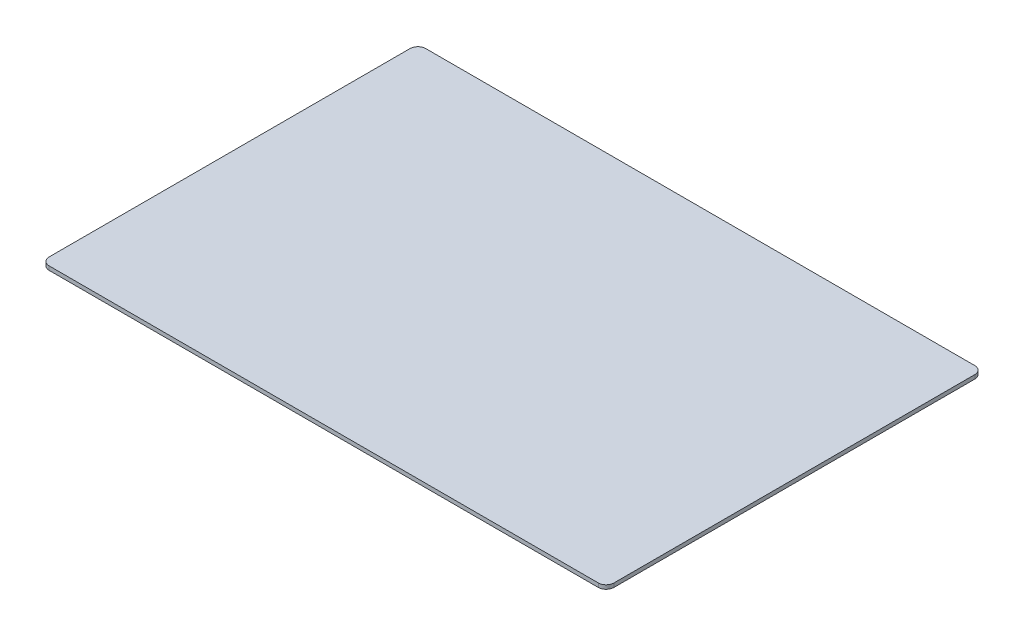
ISO-10303-21;
HEADER;
FILE_DESCRIPTION(('STEP AP214'),'2;1');
FILE_NAME('part.step','',(''),(''),'','','');
FILE_SCHEMA(('AUTOMOTIVE_DESIGN { 1 0 10303 214 1 1 1 1 }'));
ENDSEC;
DATA;
#1=APPLICATION_CONTEXT('core data for automotive mechanical design processes');
#2=APPLICATION_PROTOCOL_DEFINITION('international standard','automotive_design',2000,#1);
#3=PRODUCT_CONTEXT('',#1,'mechanical');
#4=PRODUCT('Part','Part','',(#3));
#5=PRODUCT_RELATED_PRODUCT_CATEGORY('part','',(#4));
#6=PRODUCT_DEFINITION_FORMATION('','',#4);
#7=PRODUCT_DEFINITION_CONTEXT('part definition',#1,'design');
#8=PRODUCT_DEFINITION('design','',#6,#7);
#9=PRODUCT_DEFINITION_SHAPE('','',#8);
#10=(LENGTH_UNIT() NAMED_UNIT(*) SI_UNIT(.MILLI.,.METRE.));
#11=(NAMED_UNIT(*) PLANE_ANGLE_UNIT() SI_UNIT($,.RADIAN.));
#12=(NAMED_UNIT(*) SI_UNIT($,.STERADIAN.) SOLID_ANGLE_UNIT());
#13=UNCERTAINTY_MEASURE_WITH_UNIT(LENGTH_MEASURE(1.E-05),#10,'distance_accuracy_value','');
#14=(GEOMETRIC_REPRESENTATION_CONTEXT(3) GLOBAL_UNCERTAINTY_ASSIGNED_CONTEXT((#13)) GLOBAL_UNIT_ASSIGNED_CONTEXT((#10,
#11,#12)) REPRESENTATION_CONTEXT('',''));
#15=CARTESIAN_POINT('',(0.,0.,0.));
#16=DIRECTION('',(0.,0.,1.));
#17=DIRECTION('',(1.,0.,0.));
#18=AXIS2_PLACEMENT_3D('',#15,#16,#17);
#19=CARTESIAN_POINT('',(228.6,3.175,152.4));
#20=DIRECTION('',(-1.,0.,0.));
#21=DIRECTION('',(0.,0.,1.));
#22=AXIS2_PLACEMENT_3D('',#19,#20,#21);
#23=PLANE('',#22);
#24=DIRECTION('',(0.,0.,-1.));
#25=VECTOR('',#24,1.);
#26=CARTESIAN_POINT('',(228.6,0.,152.4));
#27=LINE('',#26,#25);
#28=CARTESIAN_POINT('',(228.6,0.,146.05));
#29=VERTEX_POINT('',#28);
#30=CARTESIAN_POINT('',(228.6,0.,-146.05));
#31=VERTEX_POINT('',#30);
#32=EDGE_CURVE('E143',#29,#31,#27,.T.);
#33=ORIENTED_EDGE('',*,*,#32,.T.);
#34=DIRECTION('',(0.,-1.,0.));
#35=VECTOR('',#34,1.);
#36=CARTESIAN_POINT('',(228.6,3.175,-146.05));
#37=LINE('',#36,#35);
#38=CARTESIAN_POINT('',(228.6,3.175,-146.05));
#39=VERTEX_POINT('',#38);
#40=EDGE_CURVE('E177',#31,#39,#37,.F.);
#41=ORIENTED_EDGE('',*,*,#40,.T.);
#42=DIRECTION('',(0.,0.,-1.));
#43=VECTOR('',#42,1.);
#44=CARTESIAN_POINT('',(228.6,3.175,152.4));
#45=LINE('',#44,#43);
#46=CARTESIAN_POINT('',(228.6,3.175,146.05));
#47=VERTEX_POINT('',#46);
#48=EDGE_CURVE('E141',#47,#39,#45,.T.);
#49=ORIENTED_EDGE('',*,*,#48,.F.);
#50=DIRECTION('',(0.,-1.,0.));
#51=VECTOR('',#50,1.);
#52=CARTESIAN_POINT('',(228.6,3.175,146.05));
#53=LINE('',#52,#51);
#54=EDGE_CURVE('E173',#47,#29,#53,.T.);
#55=ORIENTED_EDGE('',*,*,#54,.T.);
#56=EDGE_LOOP('',(#33,#41,#49,#55));
#57=FACE_BOUND('',#56,.T.);
#58=ADVANCED_FACE('F41',(#57),#23,.F.);
#59=CARTESIAN_POINT('',(-228.6,3.175,-152.4));
#60=DIRECTION('',(0.,0.,1.));
#61=DIRECTION('',(1.,0.,0.));
#62=AXIS2_PLACEMENT_3D('',#59,#60,#61);
#63=PLANE('',#62);
#64=DIRECTION('',(-1.,0.,0.));
#65=VECTOR('',#64,1.);
#66=CARTESIAN_POINT('',(-228.6,0.,-152.4));
#67=LINE('',#66,#65);
#68=CARTESIAN_POINT('',(222.25,0.,-152.4));
#69=VERTEX_POINT('',#68);
#70=CARTESIAN_POINT('',(-222.25,0.,-152.4));
#71=VERTEX_POINT('',#70);
#72=EDGE_CURVE('E136',#69,#71,#67,.T.);
#73=ORIENTED_EDGE('',*,*,#72,.T.);
#74=DIRECTION('',(0.,-1.,0.));
#75=VECTOR('',#74,1.);
#76=CARTESIAN_POINT('',(-222.25,3.175,-152.4));
#77=LINE('',#76,#75);
#78=CARTESIAN_POINT('',(-222.25,3.175,-152.4));
#79=VERTEX_POINT('',#78);
#80=EDGE_CURVE('E112',#71,#79,#77,.F.);
#81=ORIENTED_EDGE('',*,*,#80,.T.);
#82=DIRECTION('',(-1.,0.,0.));
#83=VECTOR('',#82,1.);
#84=CARTESIAN_POINT('',(-228.6,3.175,-152.4));
#85=LINE('',#84,#83);
#86=CARTESIAN_POINT('',(222.25,3.175,-152.4));
#87=VERTEX_POINT('',#86);
#88=EDGE_CURVE('E197',#87,#79,#85,.T.);
#89=ORIENTED_EDGE('',*,*,#88,.F.);
#90=DIRECTION('',(0.,-1.,0.));
#91=VECTOR('',#90,1.);
#92=CARTESIAN_POINT('',(222.25,3.175,-152.4));
#93=LINE('',#92,#91);
#94=EDGE_CURVE('E118',#87,#69,#93,.T.);
#95=ORIENTED_EDGE('',*,*,#94,.T.);
#96=EDGE_LOOP('',(#73,#81,#89,#95));
#97=FACE_BOUND('',#96,.T.);
#98=ADVANCED_FACE('F222',(#97),#63,.F.);
#99=CARTESIAN_POINT('',(-228.6,3.175,152.4));
#100=DIRECTION('',(1.,0.,0.));
#101=DIRECTION('',(0.,0.,-1.));
#102=AXIS2_PLACEMENT_3D('',#99,#100,#101);
#103=PLANE('',#102);
#104=DIRECTION('',(0.,0.,1.));
#105=VECTOR('',#104,1.);
#106=CARTESIAN_POINT('',(-228.6,3.175,152.4));
#107=LINE('',#106,#105);
#108=CARTESIAN_POINT('',(-228.6,3.175,-146.05));
#109=VERTEX_POINT('',#108);
#110=CARTESIAN_POINT('',(-228.6,3.175,146.05));
#111=VERTEX_POINT('',#110);
#112=EDGE_CURVE('E127',#109,#111,#107,.T.);
#113=ORIENTED_EDGE('',*,*,#112,.F.);
#114=DIRECTION('',(0.,-1.,0.));
#115=VECTOR('',#114,1.);
#116=CARTESIAN_POINT('',(-228.6,3.175,-146.05));
#117=LINE('',#116,#115);
#118=CARTESIAN_POINT('',(-228.6,0.,-146.05));
#119=VERTEX_POINT('',#118);
#120=EDGE_CURVE('E111',#109,#119,#117,.T.);
#121=ORIENTED_EDGE('',*,*,#120,.T.);
#122=DIRECTION('',(0.,0.,1.));
#123=VECTOR('',#122,1.);
#124=CARTESIAN_POINT('',(-228.6,0.,152.4));
#125=LINE('',#124,#123);
#126=CARTESIAN_POINT('',(-228.6,0.,146.05));
#127=VERTEX_POINT('',#126);
#128=EDGE_CURVE('E125',#119,#127,#125,.T.);
#129=ORIENTED_EDGE('',*,*,#128,.T.);
#130=DIRECTION('',(0.,-1.,0.));
#131=VECTOR('',#130,1.);
#132=CARTESIAN_POINT('',(-228.6,3.175,146.05));
#133=LINE('',#132,#131);
#134=EDGE_CURVE('E130',#127,#111,#133,.F.);
#135=ORIENTED_EDGE('',*,*,#134,.T.);
#136=EDGE_LOOP('',(#113,#121,#129,#135));
#137=FACE_BOUND('',#136,.T.);
#138=ADVANCED_FACE('F124',(#137),#103,.F.);
#139=CARTESIAN_POINT('',(-228.6,3.175,152.4));
#140=DIRECTION('',(0.,0.,-1.));
#141=DIRECTION('',(-1.,0.,0.));
#142=AXIS2_PLACEMENT_3D('',#139,#140,#141);
#143=PLANE('',#142);
#144=DIRECTION('',(1.,0.,0.));
#145=VECTOR('',#144,1.);
#146=CARTESIAN_POINT('',(-228.6,0.,152.4));
#147=LINE('',#146,#145);
#148=CARTESIAN_POINT('',(-222.25,0.,152.4));
#149=VERTEX_POINT('',#148);
#150=CARTESIAN_POINT('',(222.25,0.,152.4));
#151=VERTEX_POINT('',#150);
#152=EDGE_CURVE('E135',#149,#151,#147,.T.);
#153=ORIENTED_EDGE('',*,*,#152,.T.);
#154=DIRECTION('',(0.,-1.,0.));
#155=VECTOR('',#154,1.);
#156=CARTESIAN_POINT('',(222.25,3.175,152.4));
#157=LINE('',#156,#155);
#158=CARTESIAN_POINT('',(222.25,3.175,152.4));
#159=VERTEX_POINT('',#158);
#160=EDGE_CURVE('E11',#151,#159,#157,.F.);
#161=ORIENTED_EDGE('',*,*,#160,.T.);
#162=DIRECTION('',(1.,0.,0.));
#163=VECTOR('',#162,1.);
#164=CARTESIAN_POINT('',(-228.6,3.175,152.4));
#165=LINE('',#164,#163);
#166=CARTESIAN_POINT('',(-222.25,3.175,152.4));
#167=VERTEX_POINT('',#166);
#168=EDGE_CURVE('E148',#167,#159,#165,.T.);
#169=ORIENTED_EDGE('',*,*,#168,.F.);
#170=DIRECTION('',(0.,-1.,0.));
#171=VECTOR('',#170,1.);
#172=CARTESIAN_POINT('',(-222.25,3.175,152.4));
#173=LINE('',#172,#171);
#174=EDGE_CURVE('E50',#167,#149,#173,.T.);
#175=ORIENTED_EDGE('',*,*,#174,.T.);
#176=EDGE_LOOP('',(#153,#161,#169,#175));
#177=FACE_BOUND('',#176,.T.);
#178=ADVANCED_FACE('F183',(#177),#143,.F.);
#179=CARTESIAN_POINT('',(0.,3.175,0.));
#180=DIRECTION('',(0.,-1.,0.));
#181=DIRECTION('',(0.,0.,-1.));
#182=AXIS2_PLACEMENT_3D('',#179,#180,#181);
#183=PLANE('',#182);
#184=ORIENTED_EDGE('',*,*,#88,.T.);
#185=CARTESIAN_POINT('',(-222.25,3.175,-146.05));
#186=DIRECTION('',(0.,-1.,0.));
#187=DIRECTION('',(0.,0.,-1.));
#188=AXIS2_PLACEMENT_3D('',#185,#186,#187);
#189=CIRCLE('',#188,6.35);
#190=EDGE_CURVE('E170',#79,#109,#189,.F.);
#191=ORIENTED_EDGE('',*,*,#190,.T.);
#192=ORIENTED_EDGE('',*,*,#112,.T.);
#193=CARTESIAN_POINT('',(-222.25,3.175,146.05));
#194=DIRECTION('',(0.,-1.,0.));
#195=DIRECTION('',(0.,0.,-1.));
#196=AXIS2_PLACEMENT_3D('',#193,#194,#195);
#197=CIRCLE('',#196,6.35);
#198=EDGE_CURVE('E62',#111,#167,#197,.F.);
#199=ORIENTED_EDGE('',*,*,#198,.T.);
#200=ORIENTED_EDGE('',*,*,#168,.T.);
#201=CARTESIAN_POINT('',(222.25,3.175,146.05));
#202=DIRECTION('',(0.,-1.,0.));
#203=DIRECTION('',(0.,0.,-1.));
#204=AXIS2_PLACEMENT_3D('',#201,#202,#203);
#205=CIRCLE('',#204,6.35);
#206=EDGE_CURVE('E164',#159,#47,#205,.F.);
#207=ORIENTED_EDGE('',*,*,#206,.T.);
#208=ORIENTED_EDGE('',*,*,#48,.T.);
#209=CARTESIAN_POINT('',(222.25,3.175,-146.05));
#210=DIRECTION('',(0.,-1.,0.));
#211=DIRECTION('',(0.,0.,-1.));
#212=AXIS2_PLACEMENT_3D('',#209,#210,#211);
#213=CIRCLE('',#212,6.35);
#214=EDGE_CURVE('E167',#39,#87,#213,.F.);
#215=ORIENTED_EDGE('',*,*,#214,.T.);
#216=EDGE_LOOP('',(#184,#191,#192,#199,#200,#207,#208,#215));
#217=FACE_BOUND('',#216,.T.);
#218=ADVANCED_FACE('F211',(#217),#183,.F.);
#219=CARTESIAN_POINT('',(0.,0.,0.));
#220=DIRECTION('',(0.,-1.,0.));
#221=DIRECTION('',(0.,0.,-1.));
#222=AXIS2_PLACEMENT_3D('',#219,#220,#221);
#223=PLANE('',#222);
#224=ORIENTED_EDGE('',*,*,#128,.F.);
#225=CARTESIAN_POINT('',(-222.25,0.,-146.05));
#226=DIRECTION('',(0.,-1.,0.));
#227=DIRECTION('',(0.,0.,-1.));
#228=AXIS2_PLACEMENT_3D('',#225,#226,#227);
#229=CIRCLE('',#228,6.35);
#230=EDGE_CURVE('E107',#119,#71,#229,.T.);
#231=ORIENTED_EDGE('',*,*,#230,.T.);
#232=ORIENTED_EDGE('',*,*,#72,.F.);
#233=CARTESIAN_POINT('',(222.25,0.,-146.05));
#234=DIRECTION('',(0.,-1.,0.));
#235=DIRECTION('',(0.,0.,-1.));
#236=AXIS2_PLACEMENT_3D('',#233,#234,#235);
#237=CIRCLE('',#236,6.35);
#238=EDGE_CURVE('E119',#69,#31,#237,.T.);
#239=ORIENTED_EDGE('',*,*,#238,.T.);
#240=ORIENTED_EDGE('',*,*,#32,.F.);
#241=CARTESIAN_POINT('',(222.25,0.,146.05));
#242=DIRECTION('',(0.,-1.,0.));
#243=DIRECTION('',(0.,0.,-1.));
#244=AXIS2_PLACEMENT_3D('',#241,#242,#243);
#245=CIRCLE('',#244,6.35);
#246=EDGE_CURVE('E152',#29,#151,#245,.T.);
#247=ORIENTED_EDGE('',*,*,#246,.T.);
#248=ORIENTED_EDGE('',*,*,#152,.F.);
#249=CARTESIAN_POINT('',(-222.25,0.,146.05));
#250=DIRECTION('',(0.,-1.,0.));
#251=DIRECTION('',(0.,0.,-1.));
#252=AXIS2_PLACEMENT_3D('',#249,#250,#251);
#253=CIRCLE('',#252,6.35);
#254=EDGE_CURVE('E129',#149,#127,#253,.T.);
#255=ORIENTED_EDGE('',*,*,#254,.T.);
#256=EDGE_LOOP('',(#224,#231,#232,#239,#240,#247,#248,#255));
#257=FACE_BOUND('',#256,.T.);
#258=ADVANCED_FACE('F132',(#257),#223,.T.);
#259=CARTESIAN_POINT('',(-222.25,3.175,-146.05));
#260=DIRECTION('',(0.,-1.,0.));
#261=DIRECTION('',(0.,0.,-1.));
#262=AXIS2_PLACEMENT_3D('',#259,#260,#261);
#263=CYLINDRICAL_SURFACE('',#262,6.35);
#264=ORIENTED_EDGE('',*,*,#190,.F.);
#265=ORIENTED_EDGE('',*,*,#80,.F.);
#266=ORIENTED_EDGE('',*,*,#230,.F.);
#267=ORIENTED_EDGE('',*,*,#120,.F.);
#268=EDGE_LOOP('',(#264,#265,#266,#267));
#269=FACE_BOUND('',#268,.T.);
#270=ADVANCED_FACE('F110',(#269),#263,.T.);
#271=CARTESIAN_POINT('',(222.25,3.175,-146.05));
#272=DIRECTION('',(0.,-1.,0.));
#273=DIRECTION('',(0.,0.,-1.));
#274=AXIS2_PLACEMENT_3D('',#271,#272,#273);
#275=CYLINDRICAL_SURFACE('',#274,6.35);
#276=ORIENTED_EDGE('',*,*,#214,.F.);
#277=ORIENTED_EDGE('',*,*,#40,.F.);
#278=ORIENTED_EDGE('',*,*,#238,.F.);
#279=ORIENTED_EDGE('',*,*,#94,.F.);
#280=EDGE_LOOP('',(#276,#277,#278,#279));
#281=FACE_BOUND('',#280,.T.);
#282=ADVANCED_FACE('F233',(#281),#275,.T.);
#283=CARTESIAN_POINT('',(222.25,3.175,146.05));
#284=DIRECTION('',(0.,-1.,0.));
#285=DIRECTION('',(0.,0.,-1.));
#286=AXIS2_PLACEMENT_3D('',#283,#284,#285);
#287=CYLINDRICAL_SURFACE('',#286,6.35);
#288=ORIENTED_EDGE('',*,*,#206,.F.);
#289=ORIENTED_EDGE('',*,*,#160,.F.);
#290=ORIENTED_EDGE('',*,*,#246,.F.);
#291=ORIENTED_EDGE('',*,*,#54,.F.);
#292=EDGE_LOOP('',(#288,#289,#290,#291));
#293=FACE_BOUND('',#292,.T.);
#294=ADVANCED_FACE('F190',(#293),#287,.T.);
#295=CARTESIAN_POINT('',(-222.25,3.175,146.05));
#296=DIRECTION('',(0.,-1.,0.));
#297=DIRECTION('',(0.,0.,-1.));
#298=AXIS2_PLACEMENT_3D('',#295,#296,#297);
#299=CYLINDRICAL_SURFACE('',#298,6.35);
#300=ORIENTED_EDGE('',*,*,#198,.F.);
#301=ORIENTED_EDGE('',*,*,#134,.F.);
#302=ORIENTED_EDGE('',*,*,#254,.F.);
#303=ORIENTED_EDGE('',*,*,#174,.F.);
#304=EDGE_LOOP('',(#300,#301,#302,#303));
#305=FACE_BOUND('',#304,.T.);
#306=ADVANCED_FACE('F43',(#305),#299,.T.);
#307=CLOSED_SHELL('',(#58,#98,#138,#178,#218,#258,#270,#282,#294,#306));
#308=MANIFOLD_SOLID_BREP('B2',#307);
#309=ADVANCED_BREP_SHAPE_REPRESENTATION('',(#18,#308),#14);
#310=SHAPE_DEFINITION_REPRESENTATION(#9,#309);
ENDSEC;
END-ISO-10303-21;
